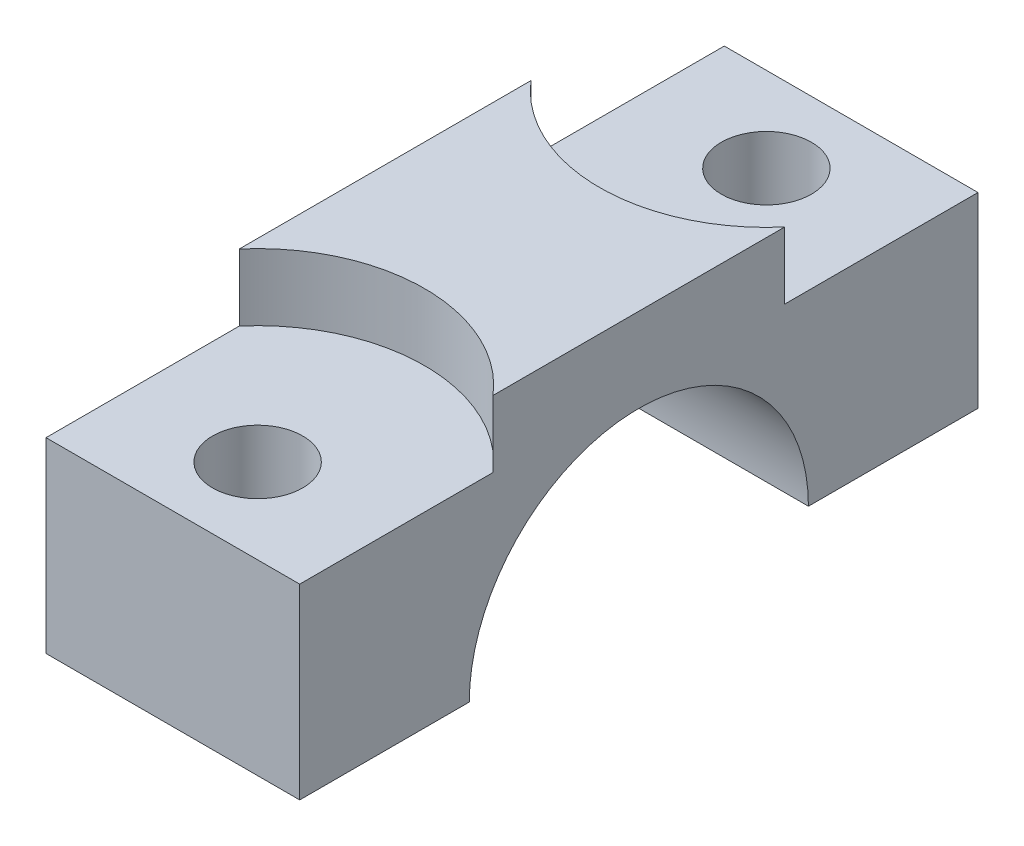
ISO-10303-21;
HEADER;
FILE_DESCRIPTION(('STEP AP214'),'2;1');
FILE_NAME('part.step','',(''),(''),'','','');
FILE_SCHEMA(('AUTOMOTIVE_DESIGN { 1 0 10303 214 1 1 1 1 }'));
ENDSEC;
DATA;
#1=APPLICATION_CONTEXT('core data for automotive mechanical design processes');
#2=APPLICATION_PROTOCOL_DEFINITION('international standard','automotive_design',2000,#1);
#3=PRODUCT_CONTEXT('',#1,'mechanical');
#4=PRODUCT('Part','Part','',(#3));
#5=PRODUCT_RELATED_PRODUCT_CATEGORY('part','',(#4));
#6=PRODUCT_DEFINITION_FORMATION('','',#4);
#7=PRODUCT_DEFINITION_CONTEXT('part definition',#1,'design');
#8=PRODUCT_DEFINITION('design','',#6,#7);
#9=PRODUCT_DEFINITION_SHAPE('','',#8);
#10=(LENGTH_UNIT() NAMED_UNIT(*) SI_UNIT(.MILLI.,.METRE.));
#11=(NAMED_UNIT(*) PLANE_ANGLE_UNIT() SI_UNIT($,.RADIAN.));
#12=(NAMED_UNIT(*) SI_UNIT($,.STERADIAN.) SOLID_ANGLE_UNIT());
#13=UNCERTAINTY_MEASURE_WITH_UNIT(LENGTH_MEASURE(1.E-05),#10,'distance_accuracy_value','');
#14=(GEOMETRIC_REPRESENTATION_CONTEXT(3) GLOBAL_UNCERTAINTY_ASSIGNED_CONTEXT((#13)) GLOBAL_UNIT_ASSIGNED_CONTEXT((#10,
#11,#12)) REPRESENTATION_CONTEXT('',''));
#15=CARTESIAN_POINT('',(0.,0.,0.));
#16=DIRECTION('',(0.,0.,1.));
#17=DIRECTION('',(1.,0.,0.));
#18=AXIS2_PLACEMENT_3D('',#15,#16,#17);
#19=CARTESIAN_POINT('',(9.5,0.,0.));
#20=DIRECTION('',(-1.,0.,0.));
#21=DIRECTION('',(0.,0.,1.));
#22=AXIS2_PLACEMENT_3D('',#19,#20,#21);
#23=CYLINDRICAL_SURFACE('',#22,12.7);
#24=CARTESIAN_POINT('',(-9.5,0.,0.));
#25=DIRECTION('',(1.,0.,0.));
#26=DIRECTION('',(0.,0.,-1.));
#27=AXIS2_PLACEMENT_3D('',#24,#25,#26);
#28=CIRCLE('',#27,12.7);
#29=CARTESIAN_POINT('',(-9.5,0.,-12.7));
#30=VERTEX_POINT('',#29);
#31=CARTESIAN_POINT('',(-9.5,0.,12.7));
#32=VERTEX_POINT('',#31);
#33=EDGE_CURVE('E167',#30,#32,#28,.T.);
#34=ORIENTED_EDGE('',*,*,#33,.F.);
#35=DIRECTION('',(-1.,0.,0.));
#36=VECTOR('',#35,1.);
#37=CARTESIAN_POINT('',(9.5,0.,-12.7));
#38=LINE('',#37,#36);
#39=CARTESIAN_POINT('',(9.5,0.,-12.7));
#40=VERTEX_POINT('',#39);
#41=EDGE_CURVE('E214',#40,#30,#38,.T.);
#42=ORIENTED_EDGE('',*,*,#41,.F.);
#43=CARTESIAN_POINT('',(9.5,0.,0.));
#44=DIRECTION('',(1.,0.,0.));
#45=DIRECTION('',(0.,0.,-1.));
#46=AXIS2_PLACEMENT_3D('',#43,#44,#45);
#47=CIRCLE('',#46,12.7);
#48=CARTESIAN_POINT('',(9.5,0.,12.7));
#49=VERTEX_POINT('',#48);
#50=EDGE_CURVE('E168',#40,#49,#47,.T.);
#51=ORIENTED_EDGE('',*,*,#50,.T.);
#52=DIRECTION('',(-1.,0.,0.));
#53=VECTOR('',#52,1.);
#54=CARTESIAN_POINT('',(9.5,0.,12.7));
#55=LINE('',#54,#53);
#56=EDGE_CURVE('E203',#49,#32,#55,.T.);
#57=ORIENTED_EDGE('',*,*,#56,.T.);
#58=EDGE_LOOP('',(#34,#42,#51,#57));
#59=FACE_BOUND('',#58,.T.);
#60=ADVANCED_FACE('F41',(#59),#23,.F.);
#61=CARTESIAN_POINT('',(9.5,0.,0.));
#62=DIRECTION('',(0.,1.,0.));
#63=DIRECTION('',(0.,0.,1.));
#64=AXIS2_PLACEMENT_3D('',#61,#62,#63);
#65=PLANE('',#64);
#66=CARTESIAN_POINT('',(0.,0.,-19.05));
#67=DIRECTION('',(0.,1.,0.));
#68=DIRECTION('',(0.,0.,1.));
#69=AXIS2_PLACEMENT_3D('',#66,#67,#68);
#70=CIRCLE('',#69,3.375);
#71=CARTESIAN_POINT('',(0.,0.,-15.675));
#72=VERTEX_POINT('',#71);
#73=EDGE_CURVE('E228',#72,#72,#70,.T.);
#74=ORIENTED_EDGE('',*,*,#73,.T.);
#75=EDGE_LOOP('',(#74));
#76=FACE_BOUND('',#75,.T.);
#77=DIRECTION('',(0.,0.,-1.));
#78=VECTOR('',#77,1.);
#79=CARTESIAN_POINT('',(-9.5,0.,0.));
#80=LINE('',#79,#78);
#81=CARTESIAN_POINT('',(-9.5,0.,-25.4));
#82=VERTEX_POINT('',#81);
#83=EDGE_CURVE('E191',#30,#82,#80,.T.);
#84=ORIENTED_EDGE('',*,*,#83,.T.);
#85=DIRECTION('',(-1.,0.,0.));
#86=VECTOR('',#85,1.);
#87=CARTESIAN_POINT('',(9.5,0.,-25.4));
#88=LINE('',#87,#86);
#89=CARTESIAN_POINT('',(9.5,0.,-25.4));
#90=VERTEX_POINT('',#89);
#91=EDGE_CURVE('E210',#90,#82,#88,.T.);
#92=ORIENTED_EDGE('',*,*,#91,.F.);
#93=DIRECTION('',(0.,0.,-1.));
#94=VECTOR('',#93,1.);
#95=CARTESIAN_POINT('',(9.5,0.,0.));
#96=LINE('',#95,#94);
#97=EDGE_CURVE('E172',#40,#90,#96,.T.);
#98=ORIENTED_EDGE('',*,*,#97,.F.);
#99=ORIENTED_EDGE('',*,*,#41,.T.);
#100=EDGE_LOOP('',(#84,#92,#98,#99));
#101=FACE_BOUND('',#100,.T.);
#102=ADVANCED_FACE('F234',(#76,#101),#65,.F.);
#103=CARTESIAN_POINT('',(9.5,0.,-25.4));
#104=DIRECTION('',(0.,0.,-1.));
#105=DIRECTION('',(-1.,0.,0.));
#106=AXIS2_PLACEMENT_3D('',#103,#104,#105);
#107=PLANE('',#106);
#108=DIRECTION('',(-1.,0.,0.));
#109=VECTOR('',#108,1.);
#110=CARTESIAN_POINT('',(9.5,14.,-25.4));
#111=LINE('',#110,#109);
#112=CARTESIAN_POINT('',(9.5,14.,-25.4));
#113=VERTEX_POINT('',#112);
#114=CARTESIAN_POINT('',(-9.5,14.,-25.4));
#115=VERTEX_POINT('',#114);
#116=EDGE_CURVE('E118',#113,#115,#111,.T.);
#117=ORIENTED_EDGE('',*,*,#116,.F.);
#118=DIRECTION('',(0.,-1.,0.));
#119=VECTOR('',#118,1.);
#120=CARTESIAN_POINT('',(9.5,0.,-25.4));
#121=LINE('',#120,#119);
#122=EDGE_CURVE('E177',#113,#90,#121,.T.);
#123=ORIENTED_EDGE('',*,*,#122,.T.);
#124=ORIENTED_EDGE('',*,*,#91,.T.);
#125=DIRECTION('',(0.,-1.,0.));
#126=VECTOR('',#125,1.);
#127=CARTESIAN_POINT('',(-9.5,0.,-25.4));
#128=LINE('',#127,#126);
#129=EDGE_CURVE('E195',#115,#82,#128,.T.);
#130=ORIENTED_EDGE('',*,*,#129,.F.);
#131=EDGE_LOOP('',(#117,#123,#124,#130));
#132=FACE_BOUND('',#131,.T.);
#133=ADVANCED_FACE('F226',(#132),#107,.T.);
#134=CARTESIAN_POINT('',(9.5,19.,0.));
#135=DIRECTION('',(0.,1.,0.));
#136=DIRECTION('',(0.,0.,1.));
#137=AXIS2_PLACEMENT_3D('',#134,#135,#136);
#138=PLANE('',#137);
#139=CARTESIAN_POINT('',(0.,19.,-19.05));
#140=DIRECTION('',(0.,1.,0.));
#141=DIRECTION('',(0.,0.,1.));
#142=AXIS2_PLACEMENT_3D('',#139,#140,#141);
#143=CIRCLE('',#142,12.5);
#144=CARTESIAN_POINT('',(-9.5,19.,-10.925961595364));
#145=VERTEX_POINT('',#144);
#146=CARTESIAN_POINT('',(9.5,19.,-10.925961595364));
#147=VERTEX_POINT('',#146);
#148=EDGE_CURVE('E132',#145,#147,#143,.T.);
#149=ORIENTED_EDGE('',*,*,#148,.F.);
#150=DIRECTION('',(0.,0.,-1.));
#151=VECTOR('',#150,1.);
#152=CARTESIAN_POINT('',(-9.5,19.,0.));
#153=LINE('',#152,#151);
#154=CARTESIAN_POINT('',(-9.5,19.,10.925961595364));
#155=VERTEX_POINT('',#154);
#156=EDGE_CURVE('E138',#155,#145,#153,.T.);
#157=ORIENTED_EDGE('',*,*,#156,.F.);
#158=CARTESIAN_POINT('',(0.,19.,19.05));
#159=DIRECTION('',(0.,1.,0.));
#160=DIRECTION('',(0.,0.,1.));
#161=AXIS2_PLACEMENT_3D('',#158,#159,#160);
#162=CIRCLE('',#161,12.5);
#163=CARTESIAN_POINT('',(9.5,19.,10.925961595364));
#164=VERTEX_POINT('',#163);
#165=EDGE_CURVE('E140',#164,#155,#162,.T.);
#166=ORIENTED_EDGE('',*,*,#165,.F.);
#167=DIRECTION('',(0.,0.,-1.));
#168=VECTOR('',#167,1.);
#169=CARTESIAN_POINT('',(9.5,19.,0.));
#170=LINE('',#169,#168);
#171=EDGE_CURVE('E181',#164,#147,#170,.T.);
#172=ORIENTED_EDGE('',*,*,#171,.T.);
#173=EDGE_LOOP('',(#149,#157,#166,#172));
#174=FACE_BOUND('',#173,.T.);
#175=ADVANCED_FACE('F259',(#174),#138,.T.);
#176=CARTESIAN_POINT('',(9.5,0.,25.4));
#177=DIRECTION('',(0.,0.,-1.));
#178=DIRECTION('',(-1.,0.,0.));
#179=AXIS2_PLACEMENT_3D('',#176,#177,#178);
#180=PLANE('',#179);
#181=DIRECTION('',(0.,-1.,0.));
#182=VECTOR('',#181,1.);
#183=CARTESIAN_POINT('',(9.5,0.,25.4));
#184=LINE('',#183,#182);
#185=CARTESIAN_POINT('',(9.5,14.,25.4));
#186=VERTEX_POINT('',#185);
#187=CARTESIAN_POINT('',(9.5,0.,25.4));
#188=VERTEX_POINT('',#187);
#189=EDGE_CURVE('E185',#186,#188,#184,.T.);
#190=ORIENTED_EDGE('',*,*,#189,.F.);
#191=DIRECTION('',(-1.,0.,0.));
#192=VECTOR('',#191,1.);
#193=CARTESIAN_POINT('',(9.5,14.,25.4));
#194=LINE('',#193,#192);
#195=CARTESIAN_POINT('',(-9.5,14.,25.4));
#196=VERTEX_POINT('',#195);
#197=EDGE_CURVE('E63',#186,#196,#194,.T.);
#198=ORIENTED_EDGE('',*,*,#197,.T.);
#199=DIRECTION('',(0.,-1.,0.));
#200=VECTOR('',#199,1.);
#201=CARTESIAN_POINT('',(-9.5,0.,25.4));
#202=LINE('',#201,#200);
#203=CARTESIAN_POINT('',(-9.5,0.,25.4));
#204=VERTEX_POINT('',#203);
#205=EDGE_CURVE('E200',#196,#204,#202,.T.);
#206=ORIENTED_EDGE('',*,*,#205,.T.);
#207=DIRECTION('',(-1.,0.,0.));
#208=VECTOR('',#207,1.);
#209=CARTESIAN_POINT('',(9.5,0.,25.4));
#210=LINE('',#209,#208);
#211=EDGE_CURVE('E206',#188,#204,#210,.T.);
#212=ORIENTED_EDGE('',*,*,#211,.F.);
#213=EDGE_LOOP('',(#190,#198,#206,#212));
#214=FACE_BOUND('',#213,.T.);
#215=ADVANCED_FACE('F251',(#214),#180,.F.);
#216=CARTESIAN_POINT('',(0.,0.,19.05));
#217=DIRECTION('',(0.,1.,0.));
#218=DIRECTION('',(0.,0.,1.));
#219=AXIS2_PLACEMENT_3D('',#216,#217,#218);
#220=CIRCLE('',#219,3.375);
#221=CARTESIAN_POINT('',(0.,0.,22.425));
#222=VERTEX_POINT('',#221);
#223=EDGE_CURVE('E154',#222,#222,#220,.T.);
#224=ORIENTED_EDGE('',*,*,#223,.T.);
#225=EDGE_LOOP('',(#224));
#226=FACE_BOUND('',#225,.T.);
#227=EDGE_CURVE('E173',#204,#32,#80,.T.);
#228=ORIENTED_EDGE('',*,*,#227,.T.);
#229=ORIENTED_EDGE('',*,*,#56,.F.);
#230=EDGE_CURVE('E178',#188,#49,#96,.T.);
#231=ORIENTED_EDGE('',*,*,#230,.F.);
#232=ORIENTED_EDGE('',*,*,#211,.T.);
#233=EDGE_LOOP('',(#228,#229,#231,#232));
#234=FACE_BOUND('',#233,.T.);
#235=ADVANCED_FACE('F243',(#226,#234),#65,.F.);
#236=CARTESIAN_POINT('',(9.5,0.,0.));
#237=DIRECTION('',(1.,0.,0.));
#238=DIRECTION('',(0.,0.,-1.));
#239=AXIS2_PLACEMENT_3D('',#236,#237,#238);
#240=PLANE('',#239);
#241=DIRECTION('',(0.,1.,0.));
#242=VECTOR('',#241,1.);
#243=CARTESIAN_POINT('',(9.5,19.,-10.925961595364));
#244=LINE('',#243,#242);
#245=CARTESIAN_POINT('',(9.5,14.,-10.925961595364));
#246=VERTEX_POINT('',#245);
#247=EDGE_CURVE('E11',#147,#246,#244,.F.);
#248=ORIENTED_EDGE('',*,*,#247,.F.);
#249=ORIENTED_EDGE('',*,*,#171,.F.);
#250=DIRECTION('',(0.,1.,0.));
#251=VECTOR('',#250,1.);
#252=CARTESIAN_POINT('',(9.5,19.,10.925961595364));
#253=LINE('',#252,#251);
#254=CARTESIAN_POINT('',(9.5,14.,10.925961595364));
#255=VERTEX_POINT('',#254);
#256=EDGE_CURVE('E220',#255,#164,#253,.T.);
#257=ORIENTED_EDGE('',*,*,#256,.F.);
#258=DIRECTION('',(0.,0.,-1.));
#259=VECTOR('',#258,1.);
#260=CARTESIAN_POINT('',(9.5,14.,0.));
#261=LINE('',#260,#259);
#262=EDGE_CURVE('E217',#186,#255,#261,.T.);
#263=ORIENTED_EDGE('',*,*,#262,.F.);
#264=ORIENTED_EDGE('',*,*,#189,.T.);
#265=ORIENTED_EDGE('',*,*,#230,.T.);
#266=ORIENTED_EDGE('',*,*,#50,.F.);
#267=ORIENTED_EDGE('',*,*,#97,.T.);
#268=ORIENTED_EDGE('',*,*,#122,.F.);
#269=DIRECTION('',(0.,0.,-1.));
#270=VECTOR('',#269,1.);
#271=CARTESIAN_POINT('',(9.5,14.,0.));
#272=LINE('',#271,#270);
#273=EDGE_CURVE('E49',#246,#113,#272,.T.);
#274=ORIENTED_EDGE('',*,*,#273,.F.);
#275=EDGE_LOOP('',(#248,#249,#257,#263,#264,#265,#266,#267,#268,#274));
#276=FACE_BOUND('',#275,.T.);
#277=ADVANCED_FACE('F229',(#276),#240,.T.);
#278=CARTESIAN_POINT('',(-9.5,0.,0.));
#279=DIRECTION('',(1.,0.,0.));
#280=DIRECTION('',(0.,0.,-1.));
#281=AXIS2_PLACEMENT_3D('',#278,#279,#280);
#282=PLANE('',#281);
#283=DIRECTION('',(0.,1.,0.));
#284=VECTOR('',#283,1.);
#285=CARTESIAN_POINT('',(-9.5,19.,-10.925961595364));
#286=LINE('',#285,#284);
#287=CARTESIAN_POINT('',(-9.5,14.,-10.925961595364));
#288=VERTEX_POINT('',#287);
#289=EDGE_CURVE('E123',#145,#288,#286,.F.);
#290=ORIENTED_EDGE('',*,*,#289,.T.);
#291=DIRECTION('',(0.,0.,-1.));
#292=VECTOR('',#291,1.);
#293=CARTESIAN_POINT('',(-9.5,14.,0.));
#294=LINE('',#293,#292);
#295=EDGE_CURVE('E115',#288,#115,#294,.T.);
#296=ORIENTED_EDGE('',*,*,#295,.T.);
#297=ORIENTED_EDGE('',*,*,#129,.T.);
#298=ORIENTED_EDGE('',*,*,#83,.F.);
#299=ORIENTED_EDGE('',*,*,#33,.T.);
#300=ORIENTED_EDGE('',*,*,#227,.F.);
#301=ORIENTED_EDGE('',*,*,#205,.F.);
#302=DIRECTION('',(0.,0.,-1.));
#303=VECTOR('',#302,1.);
#304=CARTESIAN_POINT('',(-9.5,14.,0.));
#305=LINE('',#304,#303);
#306=CARTESIAN_POINT('',(-9.5,14.,10.925961595364));
#307=VERTEX_POINT('',#306);
#308=EDGE_CURVE('E160',#196,#307,#305,.T.);
#309=ORIENTED_EDGE('',*,*,#308,.T.);
#310=DIRECTION('',(0.,1.,0.));
#311=VECTOR('',#310,1.);
#312=CARTESIAN_POINT('',(-9.5,19.,10.925961595364));
#313=LINE('',#312,#311);
#314=EDGE_CURVE('E164',#307,#155,#313,.T.);
#315=ORIENTED_EDGE('',*,*,#314,.T.);
#316=ORIENTED_EDGE('',*,*,#156,.T.);
#317=EDGE_LOOP('',(#290,#296,#297,#298,#299,#300,#301,#309,#315,#316));
#318=FACE_BOUND('',#317,.T.);
#319=ADVANCED_FACE('F135',(#318),#282,.F.);
#320=CARTESIAN_POINT('',(0.,19.,19.05));
#321=DIRECTION('',(0.,1.,0.));
#322=DIRECTION('',(0.,0.,1.));
#323=AXIS2_PLACEMENT_3D('',#320,#321,#322);
#324=CYLINDRICAL_SURFACE('',#323,12.5);
#325=CARTESIAN_POINT('',(0.,14.,19.05));
#326=DIRECTION('',(0.,1.,0.));
#327=DIRECTION('',(0.,0.,1.));
#328=AXIS2_PLACEMENT_3D('',#325,#326,#327);
#329=CIRCLE('',#328,12.5);
#330=EDGE_CURVE('E143',#255,#307,#329,.T.);
#331=ORIENTED_EDGE('',*,*,#330,.F.);
#332=ORIENTED_EDGE('',*,*,#256,.T.);
#333=ORIENTED_EDGE('',*,*,#165,.T.);
#334=ORIENTED_EDGE('',*,*,#314,.F.);
#335=EDGE_LOOP('',(#331,#332,#333,#334));
#336=FACE_BOUND('',#335,.T.);
#337=ADVANCED_FACE('F255',(#336),#324,.F.);
#338=CARTESIAN_POINT('',(3.37500000000001,14.,19.05));
#339=DIRECTION('',(0.,-1.,0.));
#340=DIRECTION('',(0.,0.,-1.));
#341=AXIS2_PLACEMENT_3D('',#338,#339,#340);
#342=PLANE('',#341);
#343=CARTESIAN_POINT('',(0.,14.,19.05));
#344=DIRECTION('',(0.,1.,0.));
#345=DIRECTION('',(0.,0.,1.));
#346=AXIS2_PLACEMENT_3D('',#343,#344,#345);
#347=CIRCLE('',#346,3.37500000000001);
#348=CARTESIAN_POINT('',(0.,14.,22.425));
#349=VERTEX_POINT('',#348);
#350=EDGE_CURVE('E150',#349,#349,#347,.T.);
#351=ORIENTED_EDGE('',*,*,#350,.F.);
#352=EDGE_LOOP('',(#351));
#353=FACE_BOUND('',#352,.T.);
#354=ORIENTED_EDGE('',*,*,#197,.F.);
#355=ORIENTED_EDGE('',*,*,#262,.T.);
#356=ORIENTED_EDGE('',*,*,#330,.T.);
#357=ORIENTED_EDGE('',*,*,#308,.F.);
#358=EDGE_LOOP('',(#354,#355,#356,#357));
#359=FACE_BOUND('',#358,.T.);
#360=ADVANCED_FACE('F252',(#353,#359),#342,.F.);
#361=CARTESIAN_POINT('',(0.,19.,19.05));
#362=DIRECTION('',(0.,1.,0.));
#363=DIRECTION('',(0.,0.,1.));
#364=AXIS2_PLACEMENT_3D('',#361,#362,#363);
#365=CYLINDRICAL_SURFACE('',#364,3.375);
#366=ORIENTED_EDGE('',*,*,#223,.F.);
#367=EDGE_LOOP('',(#366));
#368=FACE_BOUND('',#367,.T.);
#369=ORIENTED_EDGE('',*,*,#350,.T.);
#370=EDGE_LOOP('',(#369));
#371=FACE_BOUND('',#370,.T.);
#372=ADVANCED_FACE('F282',(#368,#371),#365,.F.);
#373=CARTESIAN_POINT('',(0.,19.,-19.05));
#374=DIRECTION('',(0.,1.,0.));
#375=DIRECTION('',(0.,0.,1.));
#376=AXIS2_PLACEMENT_3D('',#373,#374,#375);
#377=CYLINDRICAL_SURFACE('',#376,12.5);
#378=ORIENTED_EDGE('',*,*,#148,.T.);
#379=ORIENTED_EDGE('',*,*,#247,.T.);
#380=CARTESIAN_POINT('',(0.,14.,-19.05));
#381=DIRECTION('',(0.,1.,0.));
#382=DIRECTION('',(0.,0.,1.));
#383=AXIS2_PLACEMENT_3D('',#380,#381,#382);
#384=CIRCLE('',#383,12.5);
#385=EDGE_CURVE('E56',#288,#246,#384,.T.);
#386=ORIENTED_EDGE('',*,*,#385,.F.);
#387=ORIENTED_EDGE('',*,*,#289,.F.);
#388=EDGE_LOOP('',(#378,#379,#386,#387));
#389=FACE_BOUND('',#388,.T.);
#390=ADVANCED_FACE('F126',(#389),#377,.F.);
#391=CARTESIAN_POINT('',(3.37500000000001,14.,-19.05));
#392=DIRECTION('',(0.,-1.,0.));
#393=DIRECTION('',(0.,0.,-1.));
#394=AXIS2_PLACEMENT_3D('',#391,#392,#393);
#395=PLANE('',#394);
#396=CARTESIAN_POINT('',(0.,14.,-19.05));
#397=DIRECTION('',(0.,1.,0.));
#398=DIRECTION('',(0.,0.,1.));
#399=AXIS2_PLACEMENT_3D('',#396,#397,#398);
#400=CIRCLE('',#399,3.37500000000001);
#401=CARTESIAN_POINT('',(0.,14.,-15.675));
#402=VERTEX_POINT('',#401);
#403=EDGE_CURVE('E131',#402,#402,#400,.T.);
#404=ORIENTED_EDGE('',*,*,#403,.F.);
#405=EDGE_LOOP('',(#404));
#406=FACE_BOUND('',#405,.T.);
#407=ORIENTED_EDGE('',*,*,#385,.T.);
#408=ORIENTED_EDGE('',*,*,#273,.T.);
#409=ORIENTED_EDGE('',*,*,#116,.T.);
#410=ORIENTED_EDGE('',*,*,#295,.F.);
#411=EDGE_LOOP('',(#407,#408,#409,#410));
#412=FACE_BOUND('',#411,.T.);
#413=ADVANCED_FACE('F116',(#406,#412),#395,.F.);
#414=CARTESIAN_POINT('',(0.,19.,-19.05));
#415=DIRECTION('',(0.,1.,0.));
#416=DIRECTION('',(0.,0.,1.));
#417=AXIS2_PLACEMENT_3D('',#414,#415,#416);
#418=CYLINDRICAL_SURFACE('',#417,3.375);
#419=ORIENTED_EDGE('',*,*,#73,.F.);
#420=EDGE_LOOP('',(#419));
#421=FACE_BOUND('',#420,.T.);
#422=ORIENTED_EDGE('',*,*,#403,.T.);
#423=EDGE_LOOP('',(#422));
#424=FACE_BOUND('',#423,.T.);
#425=ADVANCED_FACE('F271',(#421,#424),#418,.F.);
#426=CLOSED_SHELL('',(#60,#102,#133,#175,#215,#235,#277,#319,#337,#360,#372,#390,#413,#425));
#427=MANIFOLD_SOLID_BREP('B2',#426);
#428=ADVANCED_BREP_SHAPE_REPRESENTATION('',(#18,#427),#14);
#429=SHAPE_DEFINITION_REPRESENTATION(#9,#428);
ENDSEC;
END-ISO-10303-21;
